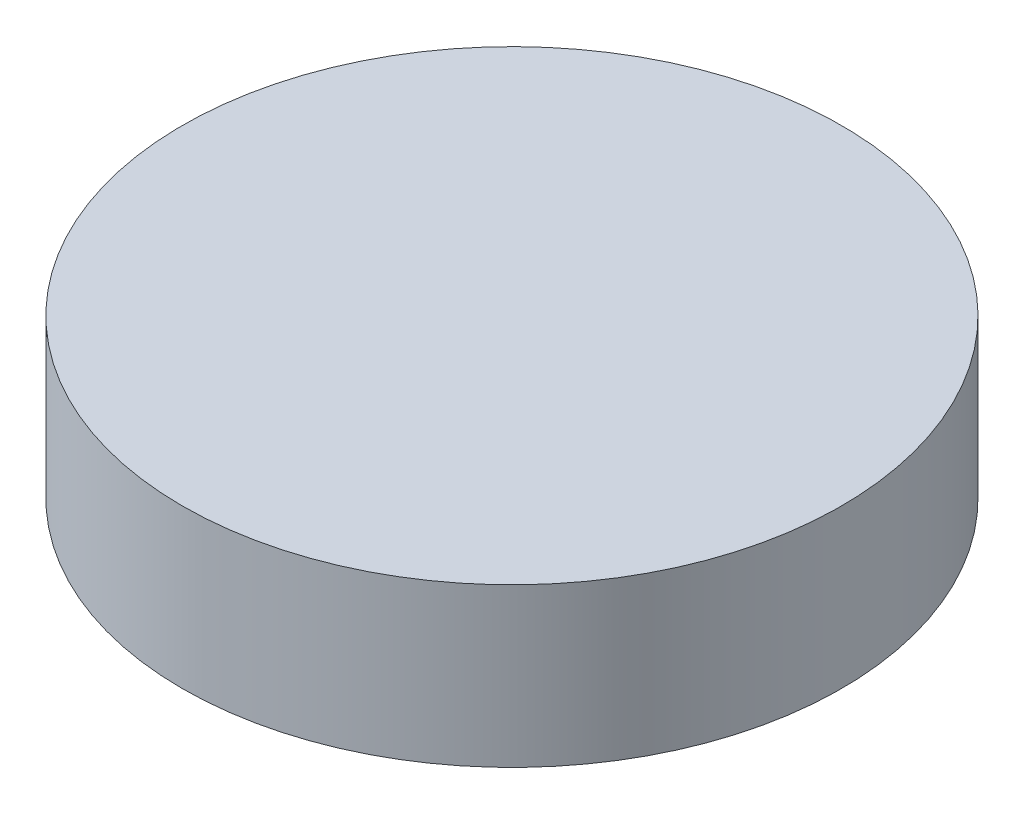
ISO-10303-21;
HEADER;
FILE_DESCRIPTION(('STEP AP214'),'2;1');
FILE_NAME('part.step','',(''),(''),'','','');
FILE_SCHEMA(('AUTOMOTIVE_DESIGN { 1 0 10303 214 1 1 1 1 }'));
ENDSEC;
DATA;
#1=APPLICATION_CONTEXT('core data for automotive mechanical design processes');
#2=APPLICATION_PROTOCOL_DEFINITION('international standard','automotive_design',2000,#1);
#3=PRODUCT_CONTEXT('',#1,'mechanical');
#4=PRODUCT('Part','Part','',(#3));
#5=PRODUCT_RELATED_PRODUCT_CATEGORY('part','',(#4));
#6=PRODUCT_DEFINITION_FORMATION('','',#4);
#7=PRODUCT_DEFINITION_CONTEXT('part definition',#1,'design');
#8=PRODUCT_DEFINITION('design','',#6,#7);
#9=PRODUCT_DEFINITION_SHAPE('','',#8);
#10=(LENGTH_UNIT() NAMED_UNIT(*) SI_UNIT(.MILLI.,.METRE.));
#11=(NAMED_UNIT(*) PLANE_ANGLE_UNIT() SI_UNIT($,.RADIAN.));
#12=(NAMED_UNIT(*) SI_UNIT($,.STERADIAN.) SOLID_ANGLE_UNIT());
#13=UNCERTAINTY_MEASURE_WITH_UNIT(LENGTH_MEASURE(1.E-05),#10,'distance_accuracy_value','');
#14=(GEOMETRIC_REPRESENTATION_CONTEXT(3) GLOBAL_UNCERTAINTY_ASSIGNED_CONTEXT((#13)) GLOBAL_UNIT_ASSIGNED_CONTEXT((#10,
#11,#12)) REPRESENTATION_CONTEXT('',''));
#15=CARTESIAN_POINT('',(0.,0.,0.));
#16=DIRECTION('',(0.,0.,1.));
#17=DIRECTION('',(1.,0.,0.));
#18=AXIS2_PLACEMENT_3D('',#15,#16,#17);
#19=CARTESIAN_POINT('',(650.,12.,-770.));
#20=DIRECTION('',(0.,-1.,0.));
#21=DIRECTION('',(0.,0.,-1.));
#22=AXIS2_PLACEMENT_3D('',#19,#20,#21);
#23=CYLINDRICAL_SURFACE('',#22,25.);
#24=CARTESIAN_POINT('',(650.,12.,-770.));
#25=DIRECTION('',(0.,1.,0.));
#26=DIRECTION('',(0.,0.,1.));
#27=AXIS2_PLACEMENT_3D('',#24,#25,#26);
#28=CIRCLE('',#27,25.);
#29=CARTESIAN_POINT('',(650.,12.,-745.));
#30=VERTEX_POINT('',#29);
#31=EDGE_CURVE('E10',#30,#30,#28,.T.);
#32=ORIENTED_EDGE('',*,*,#31,.F.);
#33=EDGE_LOOP('',(#32));
#34=FACE_BOUND('',#33,.T.);
#35=CARTESIAN_POINT('',(650.,0.,-770.));
#36=DIRECTION('',(0.,1.,0.));
#37=DIRECTION('',(0.,0.,1.));
#38=AXIS2_PLACEMENT_3D('',#35,#36,#37);
#39=CIRCLE('',#38,25.);
#40=CARTESIAN_POINT('',(650.,0.,-745.));
#41=VERTEX_POINT('',#40);
#42=EDGE_CURVE('E40',#41,#41,#39,.T.);
#43=ORIENTED_EDGE('',*,*,#42,.T.);
#44=EDGE_LOOP('',(#43));
#45=FACE_BOUND('',#44,.T.);
#46=ADVANCED_FACE('F37',(#34,#45),#23,.T.);
#47=CARTESIAN_POINT('',(650.,12.,-770.));
#48=DIRECTION('',(0.,1.,0.));
#49=DIRECTION('',(0.,0.,1.));
#50=AXIS2_PLACEMENT_3D('',#47,#48,#49);
#51=PLANE('',#50);
#52=ORIENTED_EDGE('',*,*,#31,.T.);
#53=EDGE_LOOP('',(#52));
#54=FACE_BOUND('',#53,.T.);
#55=ADVANCED_FACE('F52',(#54),#51,.T.);
#56=CARTESIAN_POINT('',(650.,0.,-770.));
#57=DIRECTION('',(0.,1.,0.));
#58=DIRECTION('',(0.,0.,1.));
#59=AXIS2_PLACEMENT_3D('',#56,#57,#58);
#60=PLANE('',#59);
#61=ORIENTED_EDGE('',*,*,#42,.F.);
#62=EDGE_LOOP('',(#61));
#63=FACE_BOUND('',#62,.T.);
#64=ADVANCED_FACE('F50',(#63),#60,.F.);
#65=CLOSED_SHELL('',(#46,#55,#64));
#66=MANIFOLD_SOLID_BREP('B2',#65);
#67=ADVANCED_BREP_SHAPE_REPRESENTATION('',(#18,#66),#14);
#68=SHAPE_DEFINITION_REPRESENTATION(#9,#67);
ENDSEC;
END-ISO-10303-21;
